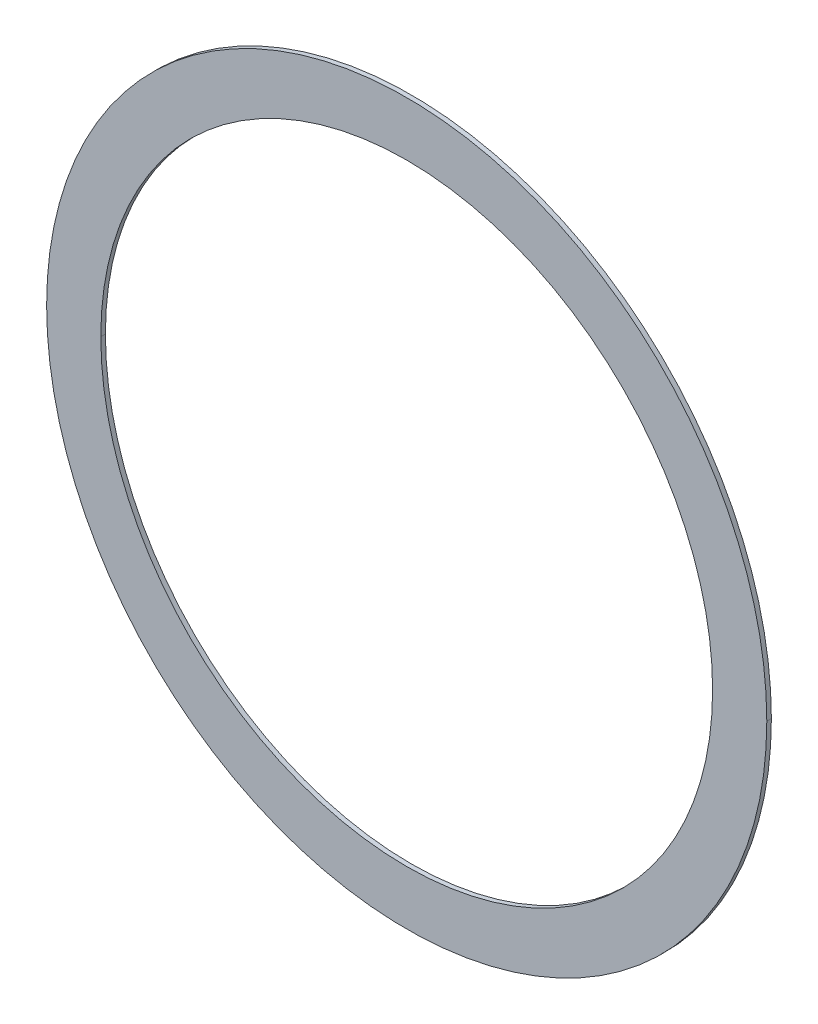
ISO-10303-21;
HEADER;
FILE_DESCRIPTION(('STEP AP214'),'2;1');
FILE_NAME('part.step','',(''),(''),'','','');
FILE_SCHEMA(('AUTOMOTIVE_DESIGN { 1 0 10303 214 1 1 1 1 }'));
ENDSEC;
DATA;
#1=APPLICATION_CONTEXT('core data for automotive mechanical design processes');
#2=APPLICATION_PROTOCOL_DEFINITION('international standard','automotive_design',2000,#1);
#3=PRODUCT_CONTEXT('',#1,'mechanical');
#4=PRODUCT('Part','Part','',(#3));
#5=PRODUCT_RELATED_PRODUCT_CATEGORY('part','',(#4));
#6=PRODUCT_DEFINITION_FORMATION('','',#4);
#7=PRODUCT_DEFINITION_CONTEXT('part definition',#1,'design');
#8=PRODUCT_DEFINITION('design','',#6,#7);
#9=PRODUCT_DEFINITION_SHAPE('','',#8);
#10=(LENGTH_UNIT() NAMED_UNIT(*) SI_UNIT(.MILLI.,.METRE.));
#11=(NAMED_UNIT(*) PLANE_ANGLE_UNIT() SI_UNIT($,.RADIAN.));
#12=(NAMED_UNIT(*) SI_UNIT($,.STERADIAN.) SOLID_ANGLE_UNIT());
#13=UNCERTAINTY_MEASURE_WITH_UNIT(LENGTH_MEASURE(1.E-05),#10,'distance_accuracy_value','');
#14=(GEOMETRIC_REPRESENTATION_CONTEXT(3) GLOBAL_UNCERTAINTY_ASSIGNED_CONTEXT((#13)) GLOBAL_UNIT_ASSIGNED_CONTEXT((#10,
#11,#12)) REPRESENTATION_CONTEXT('',''));
#15=CARTESIAN_POINT('',(0.,0.,0.));
#16=DIRECTION('',(0.,0.,1.));
#17=DIRECTION('',(1.,0.,0.));
#18=AXIS2_PLACEMENT_3D('',#15,#16,#17);
#19=CARTESIAN_POINT('',(50.637496781712,39.574998779297,0.0127));
#20=DIRECTION('',(0.,0.,1.));
#21=DIRECTION('',(1.,0.,0.));
#22=AXIS2_PLACEMENT_3D('',#19,#20,#21);
#23=PLANE('',#22);
#24=CARTESIAN_POINT('',(50.637497344392,39.574998779297,0.0127));
#25=DIRECTION('',(0.,0.,-1.));
#26=DIRECTION('',(1.,0.,0.));
#27=AXIS2_PLACEMENT_3D('',#24,#25,#26);
#28=CIRCLE('',#27,0.846999725921);
#29=CARTESIAN_POINT('',(51.484497070313,39.574998779297,0.0127));
#30=VERTEX_POINT('',#29);
#31=CARTESIAN_POINT('',(49.790497618471,39.574998779297,0.0127));
#32=VERTEX_POINT('',#31);
#33=EDGE_CURVE('E92',#30,#32,#28,.T.);
#34=ORIENTED_EDGE('',*,*,#33,.T.);
#35=CARTESIAN_POINT('',(50.637497344392,39.574998779297,0.0127));
#36=DIRECTION('',(0.,0.,-1.));
#37=DIRECTION('',(1.,0.,0.));
#38=AXIS2_PLACEMENT_3D('',#35,#36,#37);
#39=CIRCLE('',#38,0.846999725921);
#40=EDGE_CURVE('E11',#32,#30,#39,.T.);
#41=ORIENTED_EDGE('',*,*,#40,.T.);
#42=EDGE_LOOP('',(#34,#41));
#43=FACE_BOUND('',#42,.T.);
#44=CARTESIAN_POINT('',(50.637496781712,39.574998779297,0.0127));
#45=DIRECTION('',(0.,0.,-1.));
#46=DIRECTION('',(1.,0.,0.));
#47=AXIS2_PLACEMENT_3D('',#44,#45,#46);
#48=CIRCLE('',#47,0.997000288602);
#49=CARTESIAN_POINT('',(51.634497070313,39.574998779297,0.0127));
#50=VERTEX_POINT('',#49);
#51=CARTESIAN_POINT('',(49.64049649311,39.574998779297,0.0127));
#52=VERTEX_POINT('',#51);
#53=EDGE_CURVE('E28',#50,#52,#48,.T.);
#54=ORIENTED_EDGE('',*,*,#53,.F.);
#55=CARTESIAN_POINT('',(50.637496781712,39.574998779297,0.0127));
#56=DIRECTION('',(0.,0.,-1.));
#57=DIRECTION('',(1.,0.,0.));
#58=AXIS2_PLACEMENT_3D('',#55,#56,#57);
#59=CIRCLE('',#58,0.997000288602);
#60=EDGE_CURVE('E78',#52,#50,#59,.T.);
#61=ORIENTED_EDGE('',*,*,#60,.F.);
#62=EDGE_LOOP('',(#54,#61));
#63=FACE_BOUND('',#62,.T.);
#64=ADVANCED_FACE('F17',(#43,#63),#23,.T.);
#65=CARTESIAN_POINT('',(50.637497344392,39.574998779297,0.));
#66=DIRECTION('',(0.,0.,1.));
#67=DIRECTION('',(1.,0.,0.));
#68=AXIS2_PLACEMENT_3D('',#65,#66,#67);
#69=CYLINDRICAL_SURFACE('',#68,0.846999725921);
#70=DIRECTION('',(0.,0.,1.));
#71=VECTOR('',#70,1.);
#72=CARTESIAN_POINT('',(49.790497618471,39.574998779297,0.));
#73=LINE('',#72,#71);
#74=CARTESIAN_POINT('',(49.790497618471,39.574998779297,0.));
#75=VERTEX_POINT('',#74);
#76=EDGE_CURVE('E89',#75,#32,#73,.T.);
#77=ORIENTED_EDGE('',*,*,#76,.F.);
#78=CARTESIAN_POINT('',(50.637497344392,39.574998779297,0.));
#79=DIRECTION('',(0.,0.,-1.));
#80=DIRECTION('',(1.,0.,0.));
#81=AXIS2_PLACEMENT_3D('',#78,#79,#80);
#82=CIRCLE('',#81,0.846999725921);
#83=CARTESIAN_POINT('',(51.484497070313,39.574998779297,0.));
#84=VERTEX_POINT('',#83);
#85=EDGE_CURVE('E68',#75,#84,#82,.T.);
#86=ORIENTED_EDGE('',*,*,#85,.T.);
#87=DIRECTION('',(0.,0.,1.));
#88=VECTOR('',#87,1.);
#89=CARTESIAN_POINT('',(51.484497070313,39.574998779297,0.));
#90=LINE('',#89,#88);
#91=EDGE_CURVE('E21',#84,#30,#90,.T.);
#92=ORIENTED_EDGE('',*,*,#91,.T.);
#93=ORIENTED_EDGE('',*,*,#40,.F.);
#94=EDGE_LOOP('',(#77,#86,#92,#93));
#95=FACE_BOUND('',#94,.T.);
#96=ADVANCED_FACE('F118',(#95),#69,.F.);
#97=CARTESIAN_POINT('',(50.637496781712,39.574998779297,0.));
#98=DIRECTION('',(0.,0.,1.));
#99=DIRECTION('',(1.,0.,0.));
#100=AXIS2_PLACEMENT_3D('',#97,#98,#99);
#101=CYLINDRICAL_SURFACE('',#100,0.997000288602);
#102=DIRECTION('',(0.,0.,1.));
#103=VECTOR('',#102,1.);
#104=CARTESIAN_POINT('',(49.64049649311,39.574998779297,0.));
#105=LINE('',#104,#103);
#106=CARTESIAN_POINT('',(49.64049649311,39.574998779297,0.));
#107=VERTEX_POINT('',#106);
#108=EDGE_CURVE('E71',#107,#52,#105,.T.);
#109=ORIENTED_EDGE('',*,*,#108,.F.);
#110=CARTESIAN_POINT('',(50.637496781712,39.574998779297,0.));
#111=DIRECTION('',(0.,0.,1.));
#112=DIRECTION('',(1.,0.,0.));
#113=AXIS2_PLACEMENT_3D('',#110,#111,#112);
#114=CIRCLE('',#113,0.997000288602);
#115=CARTESIAN_POINT('',(51.634497070313,39.574998779297,0.));
#116=VERTEX_POINT('',#115);
#117=EDGE_CURVE('E60',#107,#116,#114,.T.);
#118=ORIENTED_EDGE('',*,*,#117,.T.);
#119=DIRECTION('',(0.,0.,1.));
#120=VECTOR('',#119,1.);
#121=CARTESIAN_POINT('',(51.634497070313,39.574998779297,0.));
#122=LINE('',#121,#120);
#123=EDGE_CURVE('E80',#116,#50,#122,.T.);
#124=ORIENTED_EDGE('',*,*,#123,.T.);
#125=ORIENTED_EDGE('',*,*,#53,.T.);
#126=EDGE_LOOP('',(#109,#118,#124,#125));
#127=FACE_BOUND('',#126,.T.);
#128=ADVANCED_FACE('F72',(#127),#101,.T.);
#129=CARTESIAN_POINT('',(50.637496781712,39.574998779297,0.));
#130=DIRECTION('',(0.,0.,1.));
#131=DIRECTION('',(1.,0.,0.));
#132=AXIS2_PLACEMENT_3D('',#129,#130,#131);
#133=PLANE('',#132);
#134=CARTESIAN_POINT('',(50.637497344392,39.574998779297,0.));
#135=DIRECTION('',(0.,0.,-1.));
#136=DIRECTION('',(1.,0.,0.));
#137=AXIS2_PLACEMENT_3D('',#134,#135,#136);
#138=CIRCLE('',#137,0.846999725921);
#139=EDGE_CURVE('E93',#84,#75,#138,.T.);
#140=ORIENTED_EDGE('',*,*,#139,.F.);
#141=ORIENTED_EDGE('',*,*,#85,.F.);
#142=EDGE_LOOP('',(#140,#141));
#143=FACE_BOUND('',#142,.T.);
#144=CARTESIAN_POINT('',(50.637496781712,39.574998779297,0.));
#145=DIRECTION('',(0.,0.,1.));
#146=DIRECTION('',(1.,0.,0.));
#147=AXIS2_PLACEMENT_3D('',#144,#145,#146);
#148=CIRCLE('',#147,0.997000288602);
#149=EDGE_CURVE('E63',#116,#107,#148,.T.);
#150=ORIENTED_EDGE('',*,*,#149,.F.);
#151=ORIENTED_EDGE('',*,*,#117,.F.);
#152=EDGE_LOOP('',(#150,#151));
#153=FACE_BOUND('',#152,.T.);
#154=ADVANCED_FACE('F19',(#143,#153),#133,.F.);
#155=CARTESIAN_POINT('',(50.637497344392,39.574998779297,0.));
#156=DIRECTION('',(0.,0.,1.));
#157=DIRECTION('',(1.,0.,0.));
#158=AXIS2_PLACEMENT_3D('',#155,#156,#157);
#159=CYLINDRICAL_SURFACE('',#158,0.846999725921);
#160=ORIENTED_EDGE('',*,*,#139,.T.);
#161=ORIENTED_EDGE('',*,*,#76,.T.);
#162=ORIENTED_EDGE('',*,*,#33,.F.);
#163=ORIENTED_EDGE('',*,*,#91,.F.);
#164=EDGE_LOOP('',(#160,#161,#162,#163));
#165=FACE_BOUND('',#164,.T.);
#166=ADVANCED_FACE('F123',(#165),#159,.F.);
#167=CARTESIAN_POINT('',(50.637496781712,39.574998779297,0.));
#168=DIRECTION('',(0.,0.,1.));
#169=DIRECTION('',(1.,0.,0.));
#170=AXIS2_PLACEMENT_3D('',#167,#168,#169);
#171=CYLINDRICAL_SURFACE('',#170,0.997000288602);
#172=ORIENTED_EDGE('',*,*,#149,.T.);
#173=ORIENTED_EDGE('',*,*,#108,.T.);
#174=ORIENTED_EDGE('',*,*,#60,.T.);
#175=ORIENTED_EDGE('',*,*,#123,.F.);
#176=EDGE_LOOP('',(#172,#173,#174,#175));
#177=FACE_BOUND('',#176,.T.);
#178=ADVANCED_FACE('F79',(#177),#171,.T.);
#179=CLOSED_SHELL('',(#64,#96,#128,#154,#166,#178));
#180=MANIFOLD_SOLID_BREP('B1',#179);
#181=ADVANCED_BREP_SHAPE_REPRESENTATION('',(#18,#180),#14);
#182=SHAPE_DEFINITION_REPRESENTATION(#9,#181);
ENDSEC;
END-ISO-10303-21;
